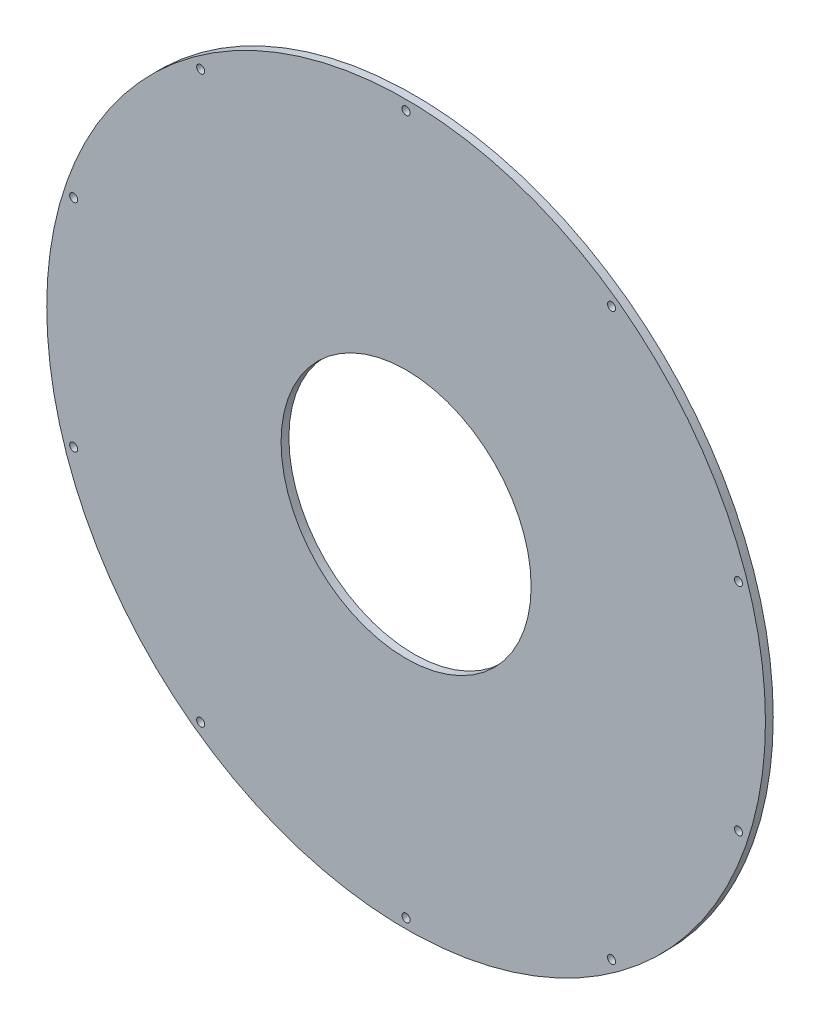
ISO-10303-21;
HEADER;
FILE_DESCRIPTION(('STEP AP214'),'2;1');
FILE_NAME('part.step','',(''),(''),'','','');
FILE_SCHEMA(('AUTOMOTIVE_DESIGN { 1 0 10303 214 1 1 1 1 }'));
ENDSEC;
DATA;
#1=APPLICATION_CONTEXT('core data for automotive mechanical design processes');
#2=APPLICATION_PROTOCOL_DEFINITION('international standard','automotive_design',2000,#1);
#3=PRODUCT_CONTEXT('',#1,'mechanical');
#4=PRODUCT('Part','Part','',(#3));
#5=PRODUCT_RELATED_PRODUCT_CATEGORY('part','',(#4));
#6=PRODUCT_DEFINITION_FORMATION('','',#4);
#7=PRODUCT_DEFINITION_CONTEXT('part definition',#1,'design');
#8=PRODUCT_DEFINITION('design','',#6,#7);
#9=PRODUCT_DEFINITION_SHAPE('','',#8);
#10=(LENGTH_UNIT() NAMED_UNIT(*) SI_UNIT(.MILLI.,.METRE.));
#11=(NAMED_UNIT(*) PLANE_ANGLE_UNIT() SI_UNIT($,.RADIAN.));
#12=(NAMED_UNIT(*) SI_UNIT($,.STERADIAN.) SOLID_ANGLE_UNIT());
#13=UNCERTAINTY_MEASURE_WITH_UNIT(LENGTH_MEASURE(1.E-05),#10,'distance_accuracy_value','');
#14=(GEOMETRIC_REPRESENTATION_CONTEXT(3) GLOBAL_UNCERTAINTY_ASSIGNED_CONTEXT((#13)) GLOBAL_UNIT_ASSIGNED_CONTEXT((#10,
#11,#12)) REPRESENTATION_CONTEXT('',''));
#15=CARTESIAN_POINT('',(0.,0.,0.));
#16=DIRECTION('',(0.,0.,1.));
#17=DIRECTION('',(1.,0.,0.));
#18=AXIS2_PLACEMENT_3D('',#15,#16,#17);
#19=CARTESIAN_POINT('',(0.,0.,3.175));
#20=DIRECTION('',(0.,0.,1.));
#21=DIRECTION('',(1.,0.,0.));
#22=AXIS2_PLACEMENT_3D('',#19,#20,#21);
#23=PLANE('',#22);
#24=CARTESIAN_POINT('',(-83.4655058255297,114.880413201244,3.175));
#25=DIRECTION('',(0.,0.,1.));
#26=DIRECTION('',(1.,0.,0.));
#27=AXIS2_PLACEMENT_3D('',#24,#25,#26);
#28=CIRCLE('',#27,1.63194999999999);
#29=CARTESIAN_POINT('',(-81.8335558255297,114.880413201244,3.175));
#30=VERTEX_POINT('',#29);
#31=EDGE_CURVE('E111',#30,#30,#28,.T.);
#32=ORIENTED_EDGE('',*,*,#31,.F.);
#33=EDGE_LOOP('',(#32));
#34=FACE_BOUND('',#33,.T.);
#35=CARTESIAN_POINT('',(-135.050025313911,43.8804132012441,3.175));
#36=DIRECTION('',(0.,0.,1.));
#37=DIRECTION('',(1.,0.,0.));
#38=AXIS2_PLACEMENT_3D('',#35,#36,#37);
#39=CIRCLE('',#38,1.63194999999999);
#40=CARTESIAN_POINT('',(-133.418075313911,43.8804132012441,3.175));
#41=VERTEX_POINT('',#40);
#42=EDGE_CURVE('E105',#41,#41,#39,.T.);
#43=ORIENTED_EDGE('',*,*,#42,.F.);
#44=EDGE_LOOP('',(#43));
#45=FACE_BOUND('',#44,.T.);
#46=CARTESIAN_POINT('',(-135.050025313912,-43.8804132012412,3.175));
#47=DIRECTION('',(0.,0.,1.));
#48=DIRECTION('',(1.,0.,0.));
#49=AXIS2_PLACEMENT_3D('',#46,#47,#48);
#50=CIRCLE('',#49,1.63194999999999);
#51=CARTESIAN_POINT('',(-133.418075313912,-43.8804132012412,3.175));
#52=VERTEX_POINT('',#51);
#53=EDGE_CURVE('E99',#52,#52,#50,.T.);
#54=ORIENTED_EDGE('',*,*,#53,.F.);
#55=EDGE_LOOP('',(#54));
#56=FACE_BOUND('',#55,.T.);
#57=CARTESIAN_POINT('',(-83.4655058255322,-114.880413201242,3.175));
#58=DIRECTION('',(0.,0.,1.));
#59=DIRECTION('',(1.,0.,0.));
#60=AXIS2_PLACEMENT_3D('',#57,#58,#59);
#61=CIRCLE('',#60,1.63194999999999);
#62=CARTESIAN_POINT('',(-81.8335558255322,-114.880413201242,3.175));
#63=VERTEX_POINT('',#62);
#64=EDGE_CURVE('E93',#63,#63,#61,.T.);
#65=ORIENTED_EDGE('',*,*,#64,.F.);
#66=EDGE_LOOP('',(#65));
#67=FACE_BOUND('',#66,.T.);
#68=CARTESIAN_POINT('',(0.,-142.,3.175));
#69=DIRECTION('',(0.,0.,1.));
#70=DIRECTION('',(1.,0.,0.));
#71=AXIS2_PLACEMENT_3D('',#68,#69,#70);
#72=CIRCLE('',#71,1.63194999999999);
#73=CARTESIAN_POINT('',(1.63194999999999,-142.,3.175));
#74=VERTEX_POINT('',#73);
#75=EDGE_CURVE('E87',#74,#74,#72,.T.);
#76=ORIENTED_EDGE('',*,*,#75,.F.);
#77=EDGE_LOOP('',(#76));
#78=FACE_BOUND('',#77,.T.);
#79=CARTESIAN_POINT('',(83.4655058255305,-114.880413201243,3.175));
#80=DIRECTION('',(0.,0.,1.));
#81=DIRECTION('',(1.,0.,0.));
#82=AXIS2_PLACEMENT_3D('',#79,#80,#81);
#83=CIRCLE('',#82,1.63194999999999);
#84=CARTESIAN_POINT('',(85.0974558255305,-114.880413201243,3.175));
#85=VERTEX_POINT('',#84);
#86=EDGE_CURVE('E81',#85,#85,#83,.T.);
#87=ORIENTED_EDGE('',*,*,#86,.F.);
#88=EDGE_LOOP('',(#87));
#89=FACE_BOUND('',#88,.T.);
#90=CARTESIAN_POINT('',(135.050025313912,-43.8804132012431,3.175));
#91=DIRECTION('',(0.,0.,1.));
#92=DIRECTION('',(1.,0.,0.));
#93=AXIS2_PLACEMENT_3D('',#90,#91,#92);
#94=CIRCLE('',#93,1.63194999999999);
#95=CARTESIAN_POINT('',(136.681975313912,-43.8804132012431,3.175));
#96=VERTEX_POINT('',#95);
#97=EDGE_CURVE('E75',#96,#96,#94,.T.);
#98=ORIENTED_EDGE('',*,*,#97,.F.);
#99=EDGE_LOOP('',(#98));
#100=FACE_BOUND('',#99,.T.);
#101=CARTESIAN_POINT('',(135.050025313912,43.8804132012422,3.175));
#102=DIRECTION('',(0.,0.,1.));
#103=DIRECTION('',(1.,0.,0.));
#104=AXIS2_PLACEMENT_3D('',#101,#102,#103);
#105=CIRCLE('',#104,1.63194999999999);
#106=CARTESIAN_POINT('',(136.681975313912,43.8804132012422,3.175));
#107=VERTEX_POINT('',#106);
#108=EDGE_CURVE('E69',#107,#107,#105,.T.);
#109=ORIENTED_EDGE('',*,*,#108,.F.);
#110=EDGE_LOOP('',(#109));
#111=FACE_BOUND('',#110,.T.);
#112=CARTESIAN_POINT('',(83.4655058255314,114.880413201242,3.175));
#113=DIRECTION('',(0.,0.,1.));
#114=DIRECTION('',(1.,0.,0.));
#115=AXIS2_PLACEMENT_3D('',#112,#113,#114);
#116=CIRCLE('',#115,1.63194999999999);
#117=CARTESIAN_POINT('',(85.0974558255313,114.880413201242,3.175));
#118=VERTEX_POINT('',#117);
#119=EDGE_CURVE('E63',#118,#118,#116,.T.);
#120=ORIENTED_EDGE('',*,*,#119,.F.);
#121=EDGE_LOOP('',(#120));
#122=FACE_BOUND('',#121,.T.);
#123=CARTESIAN_POINT('',(0.,142.,3.175));
#124=DIRECTION('',(0.,0.,1.));
#125=DIRECTION('',(1.,0.,0.));
#126=AXIS2_PLACEMENT_3D('',#123,#124,#125);
#127=CIRCLE('',#126,1.63194999999999);
#128=CARTESIAN_POINT('',(1.63194999999999,142.,3.175));
#129=VERTEX_POINT('',#128);
#130=EDGE_CURVE('E57',#129,#129,#127,.T.);
#131=ORIENTED_EDGE('',*,*,#130,.F.);
#132=EDGE_LOOP('',(#131));
#133=FACE_BOUND('',#132,.T.);
#134=CARTESIAN_POINT('',(0.,0.,3.175));
#135=DIRECTION('',(0.,0.,1.));
#136=DIRECTION('',(1.,0.,0.));
#137=AXIS2_PLACEMENT_3D('',#134,#135,#136);
#138=CIRCLE('',#137,146.);
#139=CARTESIAN_POINT('',(146.,0.,3.175));
#140=VERTEX_POINT('',#139);
#141=EDGE_CURVE('E10',#140,#140,#138,.T.);
#142=ORIENTED_EDGE('',*,*,#141,.T.);
#143=EDGE_LOOP('',(#142));
#144=FACE_BOUND('',#143,.T.);
#145=CARTESIAN_POINT('',(0.,0.,3.175));
#146=DIRECTION('',(0.,0.,1.));
#147=DIRECTION('',(1.,0.,0.));
#148=AXIS2_PLACEMENT_3D('',#145,#146,#147);
#149=CIRCLE('',#148,50.8);
#150=CARTESIAN_POINT('',(50.8,0.,3.175));
#151=VERTEX_POINT('',#150);
#152=EDGE_CURVE('E47',#151,#151,#149,.T.);
#153=ORIENTED_EDGE('',*,*,#152,.F.);
#154=EDGE_LOOP('',(#153));
#155=FACE_BOUND('',#154,.T.);
#156=ADVANCED_FACE('F36',(#34,#45,#56,#67,#78,#89,#100,#111,#122,#133,#144,#155),#23,.T.);
#157=CARTESIAN_POINT('',(0.,0.,0.));
#158=DIRECTION('',(0.,0.,1.));
#159=DIRECTION('',(1.,0.,0.));
#160=AXIS2_PLACEMENT_3D('',#157,#158,#159);
#161=PLANE('',#160);
#162=CARTESIAN_POINT('',(-83.4655058255297,114.880413201244,0.));
#163=DIRECTION('',(0.,0.,1.));
#164=DIRECTION('',(1.,0.,0.));
#165=AXIS2_PLACEMENT_3D('',#162,#163,#164);
#166=CIRCLE('',#165,1.63194999999999);
#167=CARTESIAN_POINT('',(-81.8335558255297,114.880413201244,0.));
#168=VERTEX_POINT('',#167);
#169=EDGE_CURVE('E108',#168,#168,#166,.T.);
#170=ORIENTED_EDGE('',*,*,#169,.T.);
#171=EDGE_LOOP('',(#170));
#172=FACE_BOUND('',#171,.T.);
#173=CARTESIAN_POINT('',(-135.050025313911,43.8804132012441,0.));
#174=DIRECTION('',(0.,0.,1.));
#175=DIRECTION('',(1.,0.,0.));
#176=AXIS2_PLACEMENT_3D('',#173,#174,#175);
#177=CIRCLE('',#176,1.63194999999999);
#178=CARTESIAN_POINT('',(-133.418075313911,43.8804132012441,0.));
#179=VERTEX_POINT('',#178);
#180=EDGE_CURVE('E102',#179,#179,#177,.T.);
#181=ORIENTED_EDGE('',*,*,#180,.T.);
#182=EDGE_LOOP('',(#181));
#183=FACE_BOUND('',#182,.T.);
#184=CARTESIAN_POINT('',(-135.050025313912,-43.8804132012412,0.));
#185=DIRECTION('',(0.,0.,1.));
#186=DIRECTION('',(1.,0.,0.));
#187=AXIS2_PLACEMENT_3D('',#184,#185,#186);
#188=CIRCLE('',#187,1.63194999999999);
#189=CARTESIAN_POINT('',(-133.418075313912,-43.8804132012412,0.));
#190=VERTEX_POINT('',#189);
#191=EDGE_CURVE('E96',#190,#190,#188,.T.);
#192=ORIENTED_EDGE('',*,*,#191,.T.);
#193=EDGE_LOOP('',(#192));
#194=FACE_BOUND('',#193,.T.);
#195=CARTESIAN_POINT('',(-83.4655058255322,-114.880413201242,0.));
#196=DIRECTION('',(0.,0.,1.));
#197=DIRECTION('',(1.,0.,0.));
#198=AXIS2_PLACEMENT_3D('',#195,#196,#197);
#199=CIRCLE('',#198,1.63194999999999);
#200=CARTESIAN_POINT('',(-81.8335558255322,-114.880413201242,0.));
#201=VERTEX_POINT('',#200);
#202=EDGE_CURVE('E90',#201,#201,#199,.T.);
#203=ORIENTED_EDGE('',*,*,#202,.T.);
#204=EDGE_LOOP('',(#203));
#205=FACE_BOUND('',#204,.T.);
#206=CARTESIAN_POINT('',(0.,-142.,0.));
#207=DIRECTION('',(0.,0.,1.));
#208=DIRECTION('',(1.,0.,0.));
#209=AXIS2_PLACEMENT_3D('',#206,#207,#208);
#210=CIRCLE('',#209,1.63195);
#211=CARTESIAN_POINT('',(1.63195,-142.,0.));
#212=VERTEX_POINT('',#211);
#213=EDGE_CURVE('E84',#212,#212,#210,.T.);
#214=ORIENTED_EDGE('',*,*,#213,.T.);
#215=EDGE_LOOP('',(#214));
#216=FACE_BOUND('',#215,.T.);
#217=CARTESIAN_POINT('',(83.4655058255305,-114.880413201243,0.));
#218=DIRECTION('',(0.,0.,1.));
#219=DIRECTION('',(1.,0.,0.));
#220=AXIS2_PLACEMENT_3D('',#217,#218,#219);
#221=CIRCLE('',#220,1.63194999999999);
#222=CARTESIAN_POINT('',(85.0974558255305,-114.880413201243,0.));
#223=VERTEX_POINT('',#222);
#224=EDGE_CURVE('E78',#223,#223,#221,.T.);
#225=ORIENTED_EDGE('',*,*,#224,.T.);
#226=EDGE_LOOP('',(#225));
#227=FACE_BOUND('',#226,.T.);
#228=CARTESIAN_POINT('',(135.050025313912,-43.8804132012431,0.));
#229=DIRECTION('',(0.,0.,1.));
#230=DIRECTION('',(1.,0.,0.));
#231=AXIS2_PLACEMENT_3D('',#228,#229,#230);
#232=CIRCLE('',#231,1.63194999999999);
#233=CARTESIAN_POINT('',(136.681975313912,-43.8804132012431,0.));
#234=VERTEX_POINT('',#233);
#235=EDGE_CURVE('E72',#234,#234,#232,.T.);
#236=ORIENTED_EDGE('',*,*,#235,.T.);
#237=EDGE_LOOP('',(#236));
#238=FACE_BOUND('',#237,.T.);
#239=CARTESIAN_POINT('',(135.050025313912,43.8804132012422,0.));
#240=DIRECTION('',(0.,0.,1.));
#241=DIRECTION('',(1.,0.,0.));
#242=AXIS2_PLACEMENT_3D('',#239,#240,#241);
#243=CIRCLE('',#242,1.63194999999999);
#244=CARTESIAN_POINT('',(136.681975313912,43.8804132012422,0.));
#245=VERTEX_POINT('',#244);
#246=EDGE_CURVE('E66',#245,#245,#243,.T.);
#247=ORIENTED_EDGE('',*,*,#246,.T.);
#248=EDGE_LOOP('',(#247));
#249=FACE_BOUND('',#248,.T.);
#250=CARTESIAN_POINT('',(83.4655058255314,114.880413201242,0.));
#251=DIRECTION('',(0.,0.,1.));
#252=DIRECTION('',(1.,0.,0.));
#253=AXIS2_PLACEMENT_3D('',#250,#251,#252);
#254=CIRCLE('',#253,1.63194999999999);
#255=CARTESIAN_POINT('',(85.0974558255313,114.880413201242,0.));
#256=VERTEX_POINT('',#255);
#257=EDGE_CURVE('E60',#256,#256,#254,.T.);
#258=ORIENTED_EDGE('',*,*,#257,.T.);
#259=EDGE_LOOP('',(#258));
#260=FACE_BOUND('',#259,.T.);
#261=CARTESIAN_POINT('',(0.,142.,0.));
#262=DIRECTION('',(0.,0.,1.));
#263=DIRECTION('',(1.,0.,0.));
#264=AXIS2_PLACEMENT_3D('',#261,#262,#263);
#265=CIRCLE('',#264,1.63195);
#266=CARTESIAN_POINT('',(1.63195,142.,0.));
#267=VERTEX_POINT('',#266);
#268=EDGE_CURVE('E52',#267,#267,#265,.T.);
#269=ORIENTED_EDGE('',*,*,#268,.T.);
#270=EDGE_LOOP('',(#269));
#271=FACE_BOUND('',#270,.T.);
#272=CARTESIAN_POINT('',(0.,0.,0.));
#273=DIRECTION('',(0.,0.,1.));
#274=DIRECTION('',(1.,0.,0.));
#275=AXIS2_PLACEMENT_3D('',#272,#273,#274);
#276=CIRCLE('',#275,146.);
#277=CARTESIAN_POINT('',(146.,0.,0.));
#278=VERTEX_POINT('',#277);
#279=EDGE_CURVE('E40',#278,#278,#276,.T.);
#280=ORIENTED_EDGE('',*,*,#279,.F.);
#281=EDGE_LOOP('',(#280));
#282=FACE_BOUND('',#281,.T.);
#283=CARTESIAN_POINT('',(0.,0.,0.));
#284=DIRECTION('',(0.,0.,1.));
#285=DIRECTION('',(1.,0.,0.));
#286=AXIS2_PLACEMENT_3D('',#283,#284,#285);
#287=CIRCLE('',#286,50.8);
#288=CARTESIAN_POINT('',(50.8,0.,0.));
#289=VERTEX_POINT('',#288);
#290=EDGE_CURVE('E49',#289,#289,#287,.T.);
#291=ORIENTED_EDGE('',*,*,#290,.T.);
#292=EDGE_LOOP('',(#291));
#293=FACE_BOUND('',#292,.T.);
#294=ADVANCED_FACE('F119',(#172,#183,#194,#205,#216,#227,#238,#249,#260,#271,#282,#293),#161,.F.);
#295=CARTESIAN_POINT('',(0.,0.,3.175));
#296=DIRECTION('',(0.,0.,-1.));
#297=DIRECTION('',(-1.,0.,0.));
#298=AXIS2_PLACEMENT_3D('',#295,#296,#297);
#299=CYLINDRICAL_SURFACE('',#298,146.);
#300=ORIENTED_EDGE('',*,*,#141,.F.);
#301=EDGE_LOOP('',(#300));
#302=FACE_BOUND('',#301,.T.);
#303=ORIENTED_EDGE('',*,*,#279,.T.);
#304=EDGE_LOOP('',(#303));
#305=FACE_BOUND('',#304,.T.);
#306=ADVANCED_FACE('F38',(#302,#305),#299,.T.);
#307=CARTESIAN_POINT('',(0.,0.,3.175));
#308=DIRECTION('',(0.,0.,-1.));
#309=DIRECTION('',(-1.,0.,0.));
#310=AXIS2_PLACEMENT_3D('',#307,#308,#309);
#311=CYLINDRICAL_SURFACE('',#310,50.8);
#312=ORIENTED_EDGE('',*,*,#152,.T.);
#313=EDGE_LOOP('',(#312));
#314=FACE_BOUND('',#313,.T.);
#315=ORIENTED_EDGE('',*,*,#290,.F.);
#316=EDGE_LOOP('',(#315));
#317=FACE_BOUND('',#316,.T.);
#318=ADVANCED_FACE('F141',(#314,#317),#311,.F.);
#319=CARTESIAN_POINT('',(0.,142.,3.175));
#320=DIRECTION('',(0.,0.,1.));
#321=DIRECTION('',(1.,0.,0.));
#322=AXIS2_PLACEMENT_3D('',#319,#320,#321);
#323=CYLINDRICAL_SURFACE('',#322,1.63194999999999);
#324=ORIENTED_EDGE('',*,*,#268,.F.);
#325=EDGE_LOOP('',(#324));
#326=FACE_BOUND('',#325,.T.);
#327=ORIENTED_EDGE('',*,*,#130,.T.);
#328=EDGE_LOOP('',(#327));
#329=FACE_BOUND('',#328,.T.);
#330=ADVANCED_FACE('F144',(#326,#329),#323,.F.);
#331=CARTESIAN_POINT('',(83.4655058255314,114.880413201242,3.175));
#332=DIRECTION('',(0.,0.,1.));
#333=DIRECTION('',(1.,0.,0.));
#334=AXIS2_PLACEMENT_3D('',#331,#332,#333);
#335=CYLINDRICAL_SURFACE('',#334,1.63194999999999);
#336=ORIENTED_EDGE('',*,*,#257,.F.);
#337=EDGE_LOOP('',(#336));
#338=FACE_BOUND('',#337,.T.);
#339=ORIENTED_EDGE('',*,*,#119,.T.);
#340=EDGE_LOOP('',(#339));
#341=FACE_BOUND('',#340,.T.);
#342=ADVANCED_FACE('F158',(#338,#341),#335,.F.);
#343=CARTESIAN_POINT('',(135.050025313912,43.8804132012422,3.175));
#344=DIRECTION('',(0.,0.,1.));
#345=DIRECTION('',(1.,0.,0.));
#346=AXIS2_PLACEMENT_3D('',#343,#344,#345);
#347=CYLINDRICAL_SURFACE('',#346,1.63194999999999);
#348=ORIENTED_EDGE('',*,*,#246,.F.);
#349=EDGE_LOOP('',(#348));
#350=FACE_BOUND('',#349,.T.);
#351=ORIENTED_EDGE('',*,*,#108,.T.);
#352=EDGE_LOOP('',(#351));
#353=FACE_BOUND('',#352,.T.);
#354=ADVANCED_FACE('F162',(#350,#353),#347,.F.);
#355=CARTESIAN_POINT('',(135.050025313912,-43.8804132012431,3.175));
#356=DIRECTION('',(0.,0.,1.));
#357=DIRECTION('',(1.,0.,0.));
#358=AXIS2_PLACEMENT_3D('',#355,#356,#357);
#359=CYLINDRICAL_SURFACE('',#358,1.63194999999999);
#360=ORIENTED_EDGE('',*,*,#235,.F.);
#361=EDGE_LOOP('',(#360));
#362=FACE_BOUND('',#361,.T.);
#363=ORIENTED_EDGE('',*,*,#97,.T.);
#364=EDGE_LOOP('',(#363));
#365=FACE_BOUND('',#364,.T.);
#366=ADVANCED_FACE('F166',(#362,#365),#359,.F.);
#367=CARTESIAN_POINT('',(83.4655058255305,-114.880413201243,3.175));
#368=DIRECTION('',(0.,0.,1.));
#369=DIRECTION('',(1.,0.,0.));
#370=AXIS2_PLACEMENT_3D('',#367,#368,#369);
#371=CYLINDRICAL_SURFACE('',#370,1.63194999999999);
#372=ORIENTED_EDGE('',*,*,#224,.F.);
#373=EDGE_LOOP('',(#372));
#374=FACE_BOUND('',#373,.T.);
#375=ORIENTED_EDGE('',*,*,#86,.T.);
#376=EDGE_LOOP('',(#375));
#377=FACE_BOUND('',#376,.T.);
#378=ADVANCED_FACE('F170',(#374,#377),#371,.F.);
#379=CARTESIAN_POINT('',(0.,-142.,3.175));
#380=DIRECTION('',(0.,0.,1.));
#381=DIRECTION('',(1.,0.,0.));
#382=AXIS2_PLACEMENT_3D('',#379,#380,#381);
#383=CYLINDRICAL_SURFACE('',#382,1.63194999999999);
#384=ORIENTED_EDGE('',*,*,#213,.F.);
#385=EDGE_LOOP('',(#384));
#386=FACE_BOUND('',#385,.T.);
#387=ORIENTED_EDGE('',*,*,#75,.T.);
#388=EDGE_LOOP('',(#387));
#389=FACE_BOUND('',#388,.T.);
#390=ADVANCED_FACE('F174',(#386,#389),#383,.F.);
#391=CARTESIAN_POINT('',(-83.4655058255322,-114.880413201242,3.175));
#392=DIRECTION('',(0.,0.,1.));
#393=DIRECTION('',(1.,0.,0.));
#394=AXIS2_PLACEMENT_3D('',#391,#392,#393);
#395=CYLINDRICAL_SURFACE('',#394,1.63194999999999);
#396=ORIENTED_EDGE('',*,*,#202,.F.);
#397=EDGE_LOOP('',(#396));
#398=FACE_BOUND('',#397,.T.);
#399=ORIENTED_EDGE('',*,*,#64,.T.);
#400=EDGE_LOOP('',(#399));
#401=FACE_BOUND('',#400,.T.);
#402=ADVANCED_FACE('F178',(#398,#401),#395,.F.);
#403=CARTESIAN_POINT('',(-135.050025313912,-43.8804132012412,3.175));
#404=DIRECTION('',(0.,0.,1.));
#405=DIRECTION('',(1.,0.,0.));
#406=AXIS2_PLACEMENT_3D('',#403,#404,#405);
#407=CYLINDRICAL_SURFACE('',#406,1.63194999999999);
#408=ORIENTED_EDGE('',*,*,#191,.F.);
#409=EDGE_LOOP('',(#408));
#410=FACE_BOUND('',#409,.T.);
#411=ORIENTED_EDGE('',*,*,#53,.T.);
#412=EDGE_LOOP('',(#411));
#413=FACE_BOUND('',#412,.T.);
#414=ADVANCED_FACE('F182',(#410,#413),#407,.F.);
#415=CARTESIAN_POINT('',(-135.050025313911,43.8804132012441,3.175));
#416=DIRECTION('',(0.,0.,1.));
#417=DIRECTION('',(1.,0.,0.));
#418=AXIS2_PLACEMENT_3D('',#415,#416,#417);
#419=CYLINDRICAL_SURFACE('',#418,1.63194999999999);
#420=ORIENTED_EDGE('',*,*,#180,.F.);
#421=EDGE_LOOP('',(#420));
#422=FACE_BOUND('',#421,.T.);
#423=ORIENTED_EDGE('',*,*,#42,.T.);
#424=EDGE_LOOP('',(#423));
#425=FACE_BOUND('',#424,.T.);
#426=ADVANCED_FACE('F186',(#422,#425),#419,.F.);
#427=CARTESIAN_POINT('',(-83.4655058255297,114.880413201244,3.175));
#428=DIRECTION('',(0.,0.,1.));
#429=DIRECTION('',(1.,0.,0.));
#430=AXIS2_PLACEMENT_3D('',#427,#428,#429);
#431=CYLINDRICAL_SURFACE('',#430,1.63194999999999);
#432=ORIENTED_EDGE('',*,*,#169,.F.);
#433=EDGE_LOOP('',(#432));
#434=FACE_BOUND('',#433,.T.);
#435=ORIENTED_EDGE('',*,*,#31,.T.);
#436=EDGE_LOOP('',(#435));
#437=FACE_BOUND('',#436,.T.);
#438=ADVANCED_FACE('F115',(#434,#437),#431,.F.);
#439=CLOSED_SHELL('',(#156,#294,#306,#318,#330,#342,#354,#366,#378,#390,#402,#414,#426,#438));
#440=MANIFOLD_SOLID_BREP('B2',#439);
#441=ADVANCED_BREP_SHAPE_REPRESENTATION('',(#18,#440),#14);
#442=SHAPE_DEFINITION_REPRESENTATION(#9,#441);
ENDSEC;
END-ISO-10303-21;
